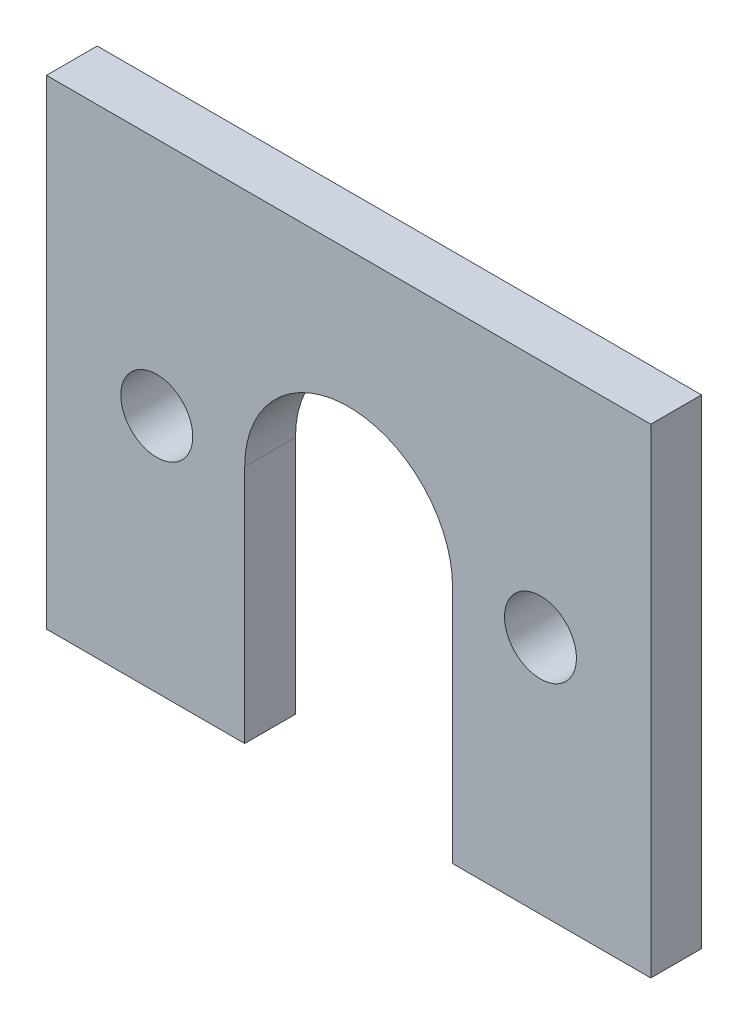
ISO-10303-21;
HEADER;
FILE_DESCRIPTION(('STEP AP214'),'2;1');
FILE_NAME('part.step','',(''),(''),'','','');
FILE_SCHEMA(('AUTOMOTIVE_DESIGN { 1 0 10303 214 1 1 1 1 }'));
ENDSEC;
DATA;
#1=APPLICATION_CONTEXT('core data for automotive mechanical design processes');
#2=APPLICATION_PROTOCOL_DEFINITION('international standard','automotive_design',2000,#1);
#3=PRODUCT_CONTEXT('',#1,'mechanical');
#4=PRODUCT('Part','Part','',(#3));
#5=PRODUCT_RELATED_PRODUCT_CATEGORY('part','',(#4));
#6=PRODUCT_DEFINITION_FORMATION('','',#4);
#7=PRODUCT_DEFINITION_CONTEXT('part definition',#1,'design');
#8=PRODUCT_DEFINITION('design','',#6,#7);
#9=PRODUCT_DEFINITION_SHAPE('','',#8);
#10=(LENGTH_UNIT() NAMED_UNIT(*) SI_UNIT(.MILLI.,.METRE.));
#11=(NAMED_UNIT(*) PLANE_ANGLE_UNIT() SI_UNIT($,.RADIAN.));
#12=(NAMED_UNIT(*) SI_UNIT($,.STERADIAN.) SOLID_ANGLE_UNIT());
#13=UNCERTAINTY_MEASURE_WITH_UNIT(LENGTH_MEASURE(1.E-05),#10,'distance_accuracy_value','');
#14=(GEOMETRIC_REPRESENTATION_CONTEXT(3) GLOBAL_UNCERTAINTY_ASSIGNED_CONTEXT((#13)) GLOBAL_UNIT_ASSIGNED_CONTEXT((#10,
#11,#12)) REPRESENTATION_CONTEXT('',''));
#15=CARTESIAN_POINT('',(0.,0.,0.));
#16=DIRECTION('',(0.,0.,1.));
#17=DIRECTION('',(1.,0.,0.));
#18=AXIS2_PLACEMENT_3D('',#15,#16,#17);
#19=CARTESIAN_POINT('',(0.,0.,3.175));
#20=DIRECTION('',(0.,0.,1.));
#21=DIRECTION('',(1.,0.,0.));
#22=AXIS2_PLACEMENT_3D('',#19,#20,#21);
#23=PLANE('',#22);
#24=CARTESIAN_POINT('',(-109.75,-9.76250000000003,3.17500000000054));
#25=DIRECTION('',(0.,0.,-1.));
#26=DIRECTION('',(-1.,0.,0.));
#27=AXIS2_PLACEMENT_3D('',#24,#25,#26);
#28=CIRCLE('',#27,2.25);
#29=CARTESIAN_POINT('',(-112.,-9.76250000000003,3.17500000000054));
#30=VERTEX_POINT('',#29);
#31=EDGE_CURVE('E227',#30,#30,#28,.T.);
#32=ORIENTED_EDGE('',*,*,#31,.T.);
#33=EDGE_LOOP('',(#32));
#34=FACE_BOUND('',#33,.T.);
#35=CARTESIAN_POINT('',(-85.7500000000001,-9.76250000000003,3.17500000000054));
#36=DIRECTION('',(0.,0.,-1.));
#37=DIRECTION('',(-1.,0.,0.));
#38=AXIS2_PLACEMENT_3D('',#35,#36,#37);
#39=CIRCLE('',#38,2.25);
#40=CARTESIAN_POINT('',(-88.0000000000001,-9.76250000000003,3.17500000000054));
#41=VERTEX_POINT('',#40);
#42=EDGE_CURVE('E243',#41,#41,#39,.T.);
#43=ORIENTED_EDGE('',*,*,#42,.T.);
#44=EDGE_LOOP('',(#43));
#45=FACE_BOUND('',#44,.T.);
#46=DIRECTION('',(0.,1.,0.));
#47=VECTOR('',#46,1.);
#48=CARTESIAN_POINT('',(-116.65,0.,3.175));
#49=LINE('',#48,#47);
#50=CARTESIAN_POINT('',(-116.65,-24.7625,3.175));
#51=VERTEX_POINT('',#50);
#52=CARTESIAN_POINT('',(-116.65,5.23749999999997,3.175));
#53=VERTEX_POINT('',#52);
#54=EDGE_CURVE('E141',#51,#53,#49,.T.);
#55=ORIENTED_EDGE('',*,*,#54,.F.);
#56=DIRECTION('',(1.,0.,0.));
#57=VECTOR('',#56,1.);
#58=CARTESIAN_POINT('',(0.,-24.7625,3.175));
#59=LINE('',#58,#57);
#60=CARTESIAN_POINT('',(-104.25,-24.7625,3.175));
#61=VERTEX_POINT('',#60);
#62=EDGE_CURVE('E203',#51,#61,#59,.T.);
#63=ORIENTED_EDGE('',*,*,#62,.T.);
#64=DIRECTION('',(0.,-1.,0.));
#65=VECTOR('',#64,1.);
#66=CARTESIAN_POINT('',(-104.25,0.,3.175));
#67=LINE('',#66,#65);
#68=CARTESIAN_POINT('',(-104.25,-9.76250000000001,3.175));
#69=VERTEX_POINT('',#68);
#70=EDGE_CURVE('E253',#69,#61,#67,.T.);
#71=ORIENTED_EDGE('',*,*,#70,.F.);
#72=CARTESIAN_POINT('',(-97.7500000000002,-9.76250000000001,3.175));
#73=DIRECTION('',(0.,0.,-1.));
#74=DIRECTION('',(-1.,0.,0.));
#75=AXIS2_PLACEMENT_3D('',#72,#73,#74);
#76=CIRCLE('',#75,6.5);
#77=CARTESIAN_POINT('',(-91.2500000000002,-9.76250000000001,3.175));
#78=VERTEX_POINT('',#77);
#79=EDGE_CURVE('E247',#69,#78,#76,.T.);
#80=ORIENTED_EDGE('',*,*,#79,.T.);
#81=DIRECTION('',(0.,-1.,0.));
#82=VECTOR('',#81,1.);
#83=CARTESIAN_POINT('',(-91.2500000000002,0.,3.175));
#84=LINE('',#83,#82);
#85=CARTESIAN_POINT('',(-91.2500000000002,-24.7625,3.175));
#86=VERTEX_POINT('',#85);
#87=EDGE_CURVE('E250',#78,#86,#84,.T.);
#88=ORIENTED_EDGE('',*,*,#87,.T.);
#89=DIRECTION('',(1.,0.,0.));
#90=VECTOR('',#89,1.);
#91=CARTESIAN_POINT('',(0.,-24.7625,3.175));
#92=LINE('',#91,#90);
#93=CARTESIAN_POINT('',(-78.8500000000003,-24.7625,3.175));
#94=VERTEX_POINT('',#93);
#95=EDGE_CURVE('E160',#86,#94,#92,.T.);
#96=ORIENTED_EDGE('',*,*,#95,.T.);
#97=DIRECTION('',(0.,-1.,0.));
#98=VECTOR('',#97,1.);
#99=CARTESIAN_POINT('',(-78.8500000000003,0.,3.175));
#100=LINE('',#99,#98);
#101=CARTESIAN_POINT('',(-78.8500000000003,5.23749999999997,3.175));
#102=VERTEX_POINT('',#101);
#103=EDGE_CURVE('E283',#102,#94,#100,.T.);
#104=ORIENTED_EDGE('',*,*,#103,.F.);
#105=DIRECTION('',(1.,0.,0.));
#106=VECTOR('',#105,1.);
#107=CARTESIAN_POINT('',(0.,5.23749999999997,3.175));
#108=LINE('',#107,#106);
#109=EDGE_CURVE('E282',#53,#102,#108,.T.);
#110=ORIENTED_EDGE('',*,*,#109,.F.);
#111=EDGE_LOOP('',(#55,#63,#71,#80,#88,#96,#104,#110));
#112=FACE_BOUND('',#111,.T.);
#113=ADVANCED_FACE('F137',(#34,#45,#112),#23,.T.);
#114=CARTESIAN_POINT('',(0.,0.,0.));
#115=DIRECTION('',(0.,0.,1.));
#116=DIRECTION('',(1.,0.,0.));
#117=AXIS2_PLACEMENT_3D('',#114,#115,#116);
#118=PLANE('',#117);
#119=CARTESIAN_POINT('',(-85.7500000000001,-9.76250000000003,0.));
#120=DIRECTION('',(0.,0.,-1.));
#121=DIRECTION('',(-1.,0.,0.));
#122=AXIS2_PLACEMENT_3D('',#119,#120,#121);
#123=CIRCLE('',#122,2.25);
#124=CARTESIAN_POINT('',(-88.0000000000001,-9.76250000000003,0.));
#125=VERTEX_POINT('',#124);
#126=EDGE_CURVE('E240',#125,#125,#123,.T.);
#127=ORIENTED_EDGE('',*,*,#126,.F.);
#128=EDGE_LOOP('',(#127));
#129=FACE_BOUND('',#128,.T.);
#130=CARTESIAN_POINT('',(-109.75,-9.76250000000003,0.));
#131=DIRECTION('',(0.,0.,-1.));
#132=DIRECTION('',(-1.,0.,0.));
#133=AXIS2_PLACEMENT_3D('',#130,#131,#132);
#134=CIRCLE('',#133,2.25);
#135=CARTESIAN_POINT('',(-112.,-9.76250000000003,0.));
#136=VERTEX_POINT('',#135);
#137=EDGE_CURVE('E223',#136,#136,#134,.T.);
#138=ORIENTED_EDGE('',*,*,#137,.F.);
#139=EDGE_LOOP('',(#138));
#140=FACE_BOUND('',#139,.T.);
#141=DIRECTION('',(1.,0.,0.));
#142=VECTOR('',#141,1.);
#143=CARTESIAN_POINT('',(0.,-24.7625,0.));
#144=LINE('',#143,#142);
#145=CARTESIAN_POINT('',(-116.65,-24.7625,0.));
#146=VERTEX_POINT('',#145);
#147=CARTESIAN_POINT('',(-104.25,-24.7625,0.));
#148=VERTEX_POINT('',#147);
#149=EDGE_CURVE('E152',#146,#148,#144,.T.);
#150=ORIENTED_EDGE('',*,*,#149,.F.);
#151=DIRECTION('',(0.,1.,0.));
#152=VECTOR('',#151,1.);
#153=CARTESIAN_POINT('',(-116.65,0.,0.));
#154=LINE('',#153,#152);
#155=CARTESIAN_POINT('',(-116.65,5.23749999999997,0.));
#156=VERTEX_POINT('',#155);
#157=EDGE_CURVE('E12',#146,#156,#154,.T.);
#158=ORIENTED_EDGE('',*,*,#157,.T.);
#159=DIRECTION('',(1.,0.,0.));
#160=VECTOR('',#159,1.);
#161=CARTESIAN_POINT('',(0.,5.23749999999997,0.));
#162=LINE('',#161,#160);
#163=CARTESIAN_POINT('',(-78.8500000000003,5.23749999999997,0.));
#164=VERTEX_POINT('',#163);
#165=EDGE_CURVE('E278',#156,#164,#162,.T.);
#166=ORIENTED_EDGE('',*,*,#165,.T.);
#167=DIRECTION('',(0.,-1.,0.));
#168=VECTOR('',#167,1.);
#169=CARTESIAN_POINT('',(-78.8500000000003,0.,0.));
#170=LINE('',#169,#168);
#171=CARTESIAN_POINT('',(-78.8500000000003,-24.7625,0.));
#172=VERTEX_POINT('',#171);
#173=EDGE_CURVE('E275',#164,#172,#170,.T.);
#174=ORIENTED_EDGE('',*,*,#173,.T.);
#175=DIRECTION('',(1.,0.,0.));
#176=VECTOR('',#175,1.);
#177=CARTESIAN_POINT('',(0.,-24.7625,0.));
#178=LINE('',#177,#176);
#179=CARTESIAN_POINT('',(-91.2500000000002,-24.7625,0.));
#180=VERTEX_POINT('',#179);
#181=EDGE_CURVE('E236',#180,#172,#178,.T.);
#182=ORIENTED_EDGE('',*,*,#181,.F.);
#183=DIRECTION('',(0.,-1.,0.));
#184=VECTOR('',#183,1.);
#185=CARTESIAN_POINT('',(-91.2500000000002,0.,0.));
#186=LINE('',#185,#184);
#187=CARTESIAN_POINT('',(-91.2500000000002,-9.76250000000001,0.));
#188=VERTEX_POINT('',#187);
#189=EDGE_CURVE('E259',#188,#180,#186,.T.);
#190=ORIENTED_EDGE('',*,*,#189,.F.);
#191=CARTESIAN_POINT('',(-97.7500000000002,-9.76250000000001,0.));
#192=DIRECTION('',(0.,0.,-1.));
#193=DIRECTION('',(-1.,0.,0.));
#194=AXIS2_PLACEMENT_3D('',#191,#192,#193);
#195=CIRCLE('',#194,6.5);
#196=CARTESIAN_POINT('',(-104.25,-9.76250000000001,0.));
#197=VERTEX_POINT('',#196);
#198=EDGE_CURVE('E246',#197,#188,#195,.T.);
#199=ORIENTED_EDGE('',*,*,#198,.F.);
#200=DIRECTION('',(0.,-1.,0.));
#201=VECTOR('',#200,1.);
#202=CARTESIAN_POINT('',(-104.25,0.,0.));
#203=LINE('',#202,#201);
#204=EDGE_CURVE('E215',#197,#148,#203,.T.);
#205=ORIENTED_EDGE('',*,*,#204,.T.);
#206=EDGE_LOOP('',(#150,#158,#166,#174,#182,#190,#199,#205));
#207=FACE_BOUND('',#206,.T.);
#208=ADVANCED_FACE('F139',(#129,#140,#207),#118,.F.);
#209=CARTESIAN_POINT('',(-116.65,0.,0.));
#210=DIRECTION('',(1.,0.,0.));
#211=DIRECTION('',(0.,1.,0.));
#212=AXIS2_PLACEMENT_3D('',#209,#210,#211);
#213=PLANE('',#212);
#214=DIRECTION('',(0.,0.,1.));
#215=VECTOR('',#214,1.);
#216=CARTESIAN_POINT('',(-116.65,-24.7625,0.));
#217=LINE('',#216,#215);
#218=EDGE_CURVE('E200',#146,#51,#217,.T.);
#219=ORIENTED_EDGE('',*,*,#218,.T.);
#220=ORIENTED_EDGE('',*,*,#54,.T.);
#221=DIRECTION('',(0.,0.,1.));
#222=VECTOR('',#221,1.);
#223=CARTESIAN_POINT('',(-116.65,5.23749999999997,0.));
#224=LINE('',#223,#222);
#225=EDGE_CURVE('E219',#156,#53,#224,.T.);
#226=ORIENTED_EDGE('',*,*,#225,.F.);
#227=ORIENTED_EDGE('',*,*,#157,.F.);
#228=EDGE_LOOP('',(#219,#220,#226,#227));
#229=FACE_BOUND('',#228,.T.);
#230=ADVANCED_FACE('F218',(#229),#213,.F.);
#231=CARTESIAN_POINT('',(-104.25,0.,3.175));
#232=DIRECTION('',(1.,0.,0.));
#233=DIRECTION('',(0.,1.,0.));
#234=AXIS2_PLACEMENT_3D('',#231,#232,#233);
#235=PLANE('',#234);
#236=ORIENTED_EDGE('',*,*,#70,.T.);
#237=DIRECTION('',(0.,0.,1.));
#238=VECTOR('',#237,1.);
#239=CARTESIAN_POINT('',(-104.25,-24.7625,0.));
#240=LINE('',#239,#238);
#241=EDGE_CURVE('E208',#148,#61,#240,.T.);
#242=ORIENTED_EDGE('',*,*,#241,.F.);
#243=ORIENTED_EDGE('',*,*,#204,.F.);
#244=DIRECTION('',(0.,0.,-1.));
#245=VECTOR('',#244,1.);
#246=CARTESIAN_POINT('',(-104.25,-9.76250000000001,3.175));
#247=LINE('',#246,#245);
#248=EDGE_CURVE('E263',#69,#197,#247,.T.);
#249=ORIENTED_EDGE('',*,*,#248,.F.);
#250=EDGE_LOOP('',(#236,#242,#243,#249));
#251=FACE_BOUND('',#250,.T.);
#252=ADVANCED_FACE('F292',(#251),#235,.T.);
#253=CARTESIAN_POINT('',(-91.2500000000002,0.,3.175));
#254=DIRECTION('',(1.,0.,0.));
#255=DIRECTION('',(0.,0.,-1.));
#256=AXIS2_PLACEMENT_3D('',#253,#254,#255);
#257=PLANE('',#256);
#258=DIRECTION('',(0.,0.,1.));
#259=VECTOR('',#258,1.);
#260=CARTESIAN_POINT('',(-91.2500000000002,-24.7625,0.));
#261=LINE('',#260,#259);
#262=EDGE_CURVE('E224',#180,#86,#261,.T.);
#263=ORIENTED_EDGE('',*,*,#262,.T.);
#264=ORIENTED_EDGE('',*,*,#87,.F.);
#265=DIRECTION('',(0.,0.,-1.));
#266=VECTOR('',#265,1.);
#267=CARTESIAN_POINT('',(-91.2500000000002,-9.76250000000001,3.175));
#268=LINE('',#267,#266);
#269=EDGE_CURVE('E256',#78,#188,#268,.T.);
#270=ORIENTED_EDGE('',*,*,#269,.T.);
#271=ORIENTED_EDGE('',*,*,#189,.T.);
#272=EDGE_LOOP('',(#263,#264,#270,#271));
#273=FACE_BOUND('',#272,.T.);
#274=ADVANCED_FACE('F267',(#273),#257,.F.);
#275=CARTESIAN_POINT('',(-97.7500000000002,-9.76250000000001,3.175));
#276=DIRECTION('',(0.,0.,-1.));
#277=DIRECTION('',(-1.,0.,0.));
#278=AXIS2_PLACEMENT_3D('',#275,#276,#277);
#279=CYLINDRICAL_SURFACE('',#278,6.5);
#280=ORIENTED_EDGE('',*,*,#198,.T.);
#281=ORIENTED_EDGE('',*,*,#269,.F.);
#282=ORIENTED_EDGE('',*,*,#79,.F.);
#283=ORIENTED_EDGE('',*,*,#248,.T.);
#284=EDGE_LOOP('',(#280,#281,#282,#283));
#285=FACE_BOUND('',#284,.T.);
#286=ADVANCED_FACE('F271',(#285),#279,.F.);
#287=CARTESIAN_POINT('',(-85.7500000000001,-9.76250000000003,0.));
#288=DIRECTION('',(0.,0.,-1.));
#289=DIRECTION('',(-1.,0.,0.));
#290=AXIS2_PLACEMENT_3D('',#287,#288,#289);
#291=CYLINDRICAL_SURFACE('',#290,2.25);
#292=ORIENTED_EDGE('',*,*,#42,.F.);
#293=EDGE_LOOP('',(#292));
#294=FACE_BOUND('',#293,.T.);
#295=ORIENTED_EDGE('',*,*,#126,.T.);
#296=EDGE_LOOP('',(#295));
#297=FACE_BOUND('',#296,.T.);
#298=ADVANCED_FACE('F312',(#294,#297),#291,.F.);
#299=CARTESIAN_POINT('',(-109.75,-9.76250000000003,0.));
#300=DIRECTION('',(0.,0.,-1.));
#301=DIRECTION('',(-1.,0.,0.));
#302=AXIS2_PLACEMENT_3D('',#299,#300,#301);
#303=CYLINDRICAL_SURFACE('',#302,2.25);
#304=ORIENTED_EDGE('',*,*,#31,.F.);
#305=EDGE_LOOP('',(#304));
#306=FACE_BOUND('',#305,.T.);
#307=ORIENTED_EDGE('',*,*,#137,.T.);
#308=EDGE_LOOP('',(#307));
#309=FACE_BOUND('',#308,.T.);
#310=ADVANCED_FACE('F316',(#306,#309),#303,.F.);
#311=CARTESIAN_POINT('',(0.,5.23749999999997,0.));
#312=DIRECTION('',(0.,-1.,0.));
#313=DIRECTION('',(1.,0.,0.));
#314=AXIS2_PLACEMENT_3D('',#311,#312,#313);
#315=PLANE('',#314);
#316=ORIENTED_EDGE('',*,*,#109,.T.);
#317=DIRECTION('',(0.,0.,1.));
#318=VECTOR('',#317,1.);
#319=CARTESIAN_POINT('',(-78.8500000000003,5.23749999999997,0.));
#320=LINE('',#319,#318);
#321=EDGE_CURVE('E235',#164,#102,#320,.T.);
#322=ORIENTED_EDGE('',*,*,#321,.F.);
#323=ORIENTED_EDGE('',*,*,#165,.F.);
#324=ORIENTED_EDGE('',*,*,#225,.T.);
#325=EDGE_LOOP('',(#316,#322,#323,#324));
#326=FACE_BOUND('',#325,.T.);
#327=ADVANCED_FACE('F320',(#326),#315,.F.);
#328=CARTESIAN_POINT('',(0.,-24.7625,0.));
#329=DIRECTION('',(0.,-1.,0.));
#330=DIRECTION('',(0.,0.,-1.));
#331=AXIS2_PLACEMENT_3D('',#328,#329,#330);
#332=PLANE('',#331);
#333=ORIENTED_EDGE('',*,*,#95,.F.);
#334=ORIENTED_EDGE('',*,*,#262,.F.);
#335=ORIENTED_EDGE('',*,*,#181,.T.);
#336=DIRECTION('',(0.,0.,1.));
#337=VECTOR('',#336,1.);
#338=CARTESIAN_POINT('',(-78.8500000000003,-24.7625,0.));
#339=LINE('',#338,#337);
#340=EDGE_CURVE('E229',#172,#94,#339,.T.);
#341=ORIENTED_EDGE('',*,*,#340,.T.);
#342=EDGE_LOOP('',(#333,#334,#335,#341));
#343=FACE_BOUND('',#342,.T.);
#344=ADVANCED_FACE('F328',(#343),#332,.T.);
#345=CARTESIAN_POINT('',(-78.8500000000003,0.,0.));
#346=DIRECTION('',(-1.,0.,0.));
#347=DIRECTION('',(0.,0.,1.));
#348=AXIS2_PLACEMENT_3D('',#345,#346,#347);
#349=PLANE('',#348);
#350=ORIENTED_EDGE('',*,*,#103,.T.);
#351=ORIENTED_EDGE('',*,*,#340,.F.);
#352=ORIENTED_EDGE('',*,*,#173,.F.);
#353=ORIENTED_EDGE('',*,*,#321,.T.);
#354=EDGE_LOOP('',(#350,#351,#352,#353));
#355=FACE_BOUND('',#354,.T.);
#356=ADVANCED_FACE('F329',(#355),#349,.F.);
#357=CARTESIAN_POINT('',(0.,-24.7625,0.));
#358=DIRECTION('',(0.,-1.,0.));
#359=DIRECTION('',(0.,0.,-1.));
#360=AXIS2_PLACEMENT_3D('',#357,#358,#359);
#361=PLANE('',#360);
#362=ORIENTED_EDGE('',*,*,#62,.F.);
#363=ORIENTED_EDGE('',*,*,#218,.F.);
#364=ORIENTED_EDGE('',*,*,#149,.T.);
#365=ORIENTED_EDGE('',*,*,#241,.T.);
#366=EDGE_LOOP('',(#362,#363,#364,#365));
#367=FACE_BOUND('',#366,.T.);
#368=ADVANCED_FACE('F201',(#367),#361,.T.);
#369=CLOSED_SHELL('',(#113,#208,#230,#252,#274,#286,#298,#310,#327,#344,#356,#368));
#370=MANIFOLD_SOLID_BREP('B2',#369);
#371=ADVANCED_BREP_SHAPE_REPRESENTATION('',(#18,#370),#14);
#372=SHAPE_DEFINITION_REPRESENTATION(#9,#371);
ENDSEC;
END-ISO-10303-21;
